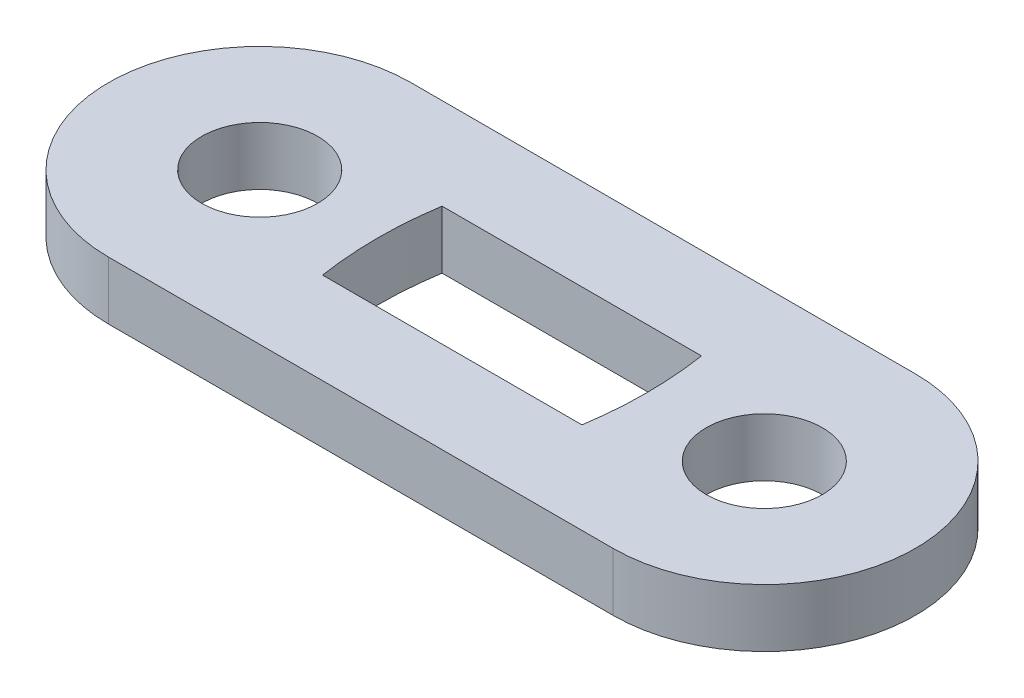
ISO-10303-21;
HEADER;
FILE_DESCRIPTION(('STEP AP214'),'2;1');
FILE_NAME('part.step','',(''),(''),'','','');
FILE_SCHEMA(('AUTOMOTIVE_DESIGN { 1 0 10303 214 1 1 1 1 }'));
ENDSEC;
DATA;
#1=APPLICATION_CONTEXT('core data for automotive mechanical design processes');
#2=APPLICATION_PROTOCOL_DEFINITION('international standard','automotive_design',2000,#1);
#3=PRODUCT_CONTEXT('',#1,'mechanical');
#4=PRODUCT('Part','Part','',(#3));
#5=PRODUCT_RELATED_PRODUCT_CATEGORY('part','',(#4));
#6=PRODUCT_DEFINITION_FORMATION('','',#4);
#7=PRODUCT_DEFINITION_CONTEXT('part definition',#1,'design');
#8=PRODUCT_DEFINITION('design','',#6,#7);
#9=PRODUCT_DEFINITION_SHAPE('','',#8);
#10=(LENGTH_UNIT() NAMED_UNIT(*) SI_UNIT(.MILLI.,.METRE.));
#11=(NAMED_UNIT(*) PLANE_ANGLE_UNIT() SI_UNIT($,.RADIAN.));
#12=(NAMED_UNIT(*) SI_UNIT($,.STERADIAN.) SOLID_ANGLE_UNIT());
#13=UNCERTAINTY_MEASURE_WITH_UNIT(LENGTH_MEASURE(1.E-05),#10,'distance_accuracy_value','');
#14=(GEOMETRIC_REPRESENTATION_CONTEXT(3) GLOBAL_UNCERTAINTY_ASSIGNED_CONTEXT((#13)) GLOBAL_UNIT_ASSIGNED_CONTEXT((#10,
#11,#12)) REPRESENTATION_CONTEXT('',''));
#15=CARTESIAN_POINT('',(0.,0.,0.));
#16=DIRECTION('',(0.,0.,1.));
#17=DIRECTION('',(1.,0.,0.));
#18=AXIS2_PLACEMENT_3D('',#15,#16,#17);
#19=CARTESIAN_POINT('',(0.,0.79375,4.13373631574242));
#20=DIRECTION('',(0.,0.,-1.));
#21=DIRECTION('',(-1.,0.,0.));
#22=AXIS2_PLACEMENT_3D('',#19,#20,#21);
#23=PLANE('',#22);
#24=DIRECTION('',(1.,0.,0.));
#25=VECTOR('',#24,1.);
#26=CARTESIAN_POINT('',(0.,-0.79375,4.13373631574242));
#27=LINE('',#26,#25);
#28=CARTESIAN_POINT('',(-6.9,-0.79375,4.13373631574242));
#29=VERTEX_POINT('',#28);
#30=CARTESIAN_POINT('',(6.9,-0.79375,4.13373631574243));
#31=VERTEX_POINT('',#30);
#32=EDGE_CURVE('E145',#29,#31,#27,.T.);
#33=ORIENTED_EDGE('',*,*,#32,.T.);
#34=DIRECTION('',(0.,-1.,0.));
#35=VECTOR('',#34,1.);
#36=CARTESIAN_POINT('',(6.9,0.79375,4.13373631574243));
#37=LINE('',#36,#35);
#38=CARTESIAN_POINT('',(6.9,0.79375,4.13373631574243));
#39=VERTEX_POINT('',#38);
#40=EDGE_CURVE('E11',#39,#31,#37,.T.);
#41=ORIENTED_EDGE('',*,*,#40,.F.);
#42=DIRECTION('',(1.,0.,0.));
#43=VECTOR('',#42,1.);
#44=CARTESIAN_POINT('',(0.,0.79375,4.13373631574242));
#45=LINE('',#44,#43);
#46=CARTESIAN_POINT('',(-6.9,0.79375,4.13373631574242));
#47=VERTEX_POINT('',#46);
#48=EDGE_CURVE('E115',#47,#39,#45,.T.);
#49=ORIENTED_EDGE('',*,*,#48,.F.);
#50=DIRECTION('',(0.,-1.,0.));
#51=VECTOR('',#50,1.);
#52=CARTESIAN_POINT('',(-6.9,0.79375,4.13373631574242));
#53=LINE('',#52,#51);
#54=EDGE_CURVE('E152',#47,#29,#53,.T.);
#55=ORIENTED_EDGE('',*,*,#54,.T.);
#56=EDGE_LOOP('',(#33,#41,#49,#55));
#57=FACE_BOUND('',#56,.T.);
#58=ADVANCED_FACE('F34',(#57),#23,.F.);
#59=CARTESIAN_POINT('',(6.9,0.79375,0.));
#60=DIRECTION('',(0.,-1.,0.));
#61=DIRECTION('',(0.,0.,-1.));
#62=AXIS2_PLACEMENT_3D('',#59,#60,#61);
#63=CYLINDRICAL_SURFACE('',#62,4.13373631574242);
#64=CARTESIAN_POINT('',(6.9,-0.79375,0.));
#65=DIRECTION('',(0.,1.,0.));
#66=DIRECTION('',(0.,0.,1.));
#67=AXIS2_PLACEMENT_3D('',#64,#65,#66);
#68=CIRCLE('',#67,4.13373631574242);
#69=CARTESIAN_POINT('',(6.9,-0.79375,-4.13373631574242));
#70=VERTEX_POINT('',#69);
#71=EDGE_CURVE('E120',#31,#70,#68,.T.);
#72=ORIENTED_EDGE('',*,*,#71,.T.);
#73=DIRECTION('',(0.,-1.,0.));
#74=VECTOR('',#73,1.);
#75=CARTESIAN_POINT('',(6.9,0.79375,-4.13373631574242));
#76=LINE('',#75,#74);
#77=CARTESIAN_POINT('',(6.9,0.79375,-4.13373631574242));
#78=VERTEX_POINT('',#77);
#79=EDGE_CURVE('E44',#78,#70,#76,.T.);
#80=ORIENTED_EDGE('',*,*,#79,.F.);
#81=CARTESIAN_POINT('',(6.9,0.79375,0.));
#82=DIRECTION('',(0.,1.,0.));
#83=DIRECTION('',(0.,0.,1.));
#84=AXIS2_PLACEMENT_3D('',#81,#82,#83);
#85=CIRCLE('',#84,4.13373631574242);
#86=EDGE_CURVE('E109',#39,#78,#85,.T.);
#87=ORIENTED_EDGE('',*,*,#86,.F.);
#88=ORIENTED_EDGE('',*,*,#40,.T.);
#89=EDGE_LOOP('',(#72,#80,#87,#88));
#90=FACE_BOUND('',#89,.T.);
#91=ADVANCED_FACE('F119',(#90),#63,.T.);
#92=CARTESIAN_POINT('',(0.,0.79375,-4.13373631574242));
#93=DIRECTION('',(0.,0.,1.));
#94=DIRECTION('',(1.,0.,0.));
#95=AXIS2_PLACEMENT_3D('',#92,#93,#94);
#96=PLANE('',#95);
#97=DIRECTION('',(-1.,0.,0.));
#98=VECTOR('',#97,1.);
#99=CARTESIAN_POINT('',(0.,-0.79375,-4.13373631574242));
#100=LINE('',#99,#98);
#101=CARTESIAN_POINT('',(-6.9,-0.79375,-4.13373631574242));
#102=VERTEX_POINT('',#101);
#103=EDGE_CURVE('E82',#70,#102,#100,.T.);
#104=ORIENTED_EDGE('',*,*,#103,.T.);
#105=DIRECTION('',(0.,-1.,0.));
#106=VECTOR('',#105,1.);
#107=CARTESIAN_POINT('',(-6.9,0.79375,-4.13373631574242));
#108=LINE('',#107,#106);
#109=CARTESIAN_POINT('',(-6.9,0.79375,-4.13373631574242));
#110=VERTEX_POINT('',#109);
#111=EDGE_CURVE('E121',#110,#102,#108,.T.);
#112=ORIENTED_EDGE('',*,*,#111,.F.);
#113=DIRECTION('',(-1.,0.,0.));
#114=VECTOR('',#113,1.);
#115=CARTESIAN_POINT('',(0.,0.79375,-4.13373631574242));
#116=LINE('',#115,#114);
#117=EDGE_CURVE('E113',#78,#110,#116,.T.);
#118=ORIENTED_EDGE('',*,*,#117,.F.);
#119=ORIENTED_EDGE('',*,*,#79,.T.);
#120=EDGE_LOOP('',(#104,#112,#118,#119));
#121=FACE_BOUND('',#120,.T.);
#122=ADVANCED_FACE('F123',(#121),#96,.F.);
#123=CARTESIAN_POINT('',(6.9,0.79375,0.));
#124=DIRECTION('',(0.,-1.,0.));
#125=DIRECTION('',(0.,0.,-1.));
#126=AXIS2_PLACEMENT_3D('',#123,#124,#125);
#127=CYLINDRICAL_SURFACE('',#126,10.5737712135297);
#128=CARTESIAN_POINT('',(6.9,-0.79375,0.));
#129=DIRECTION('',(0.,1.,0.));
#130=DIRECTION('',(0.,0.,1.));
#131=AXIS2_PLACEMENT_3D('',#128,#129,#130);
#132=CIRCLE('',#131,10.5737712135297);
#133=CARTESIAN_POINT('',(-3.54679584019391,-0.79375,-1.63373631574242));
#134=VERTEX_POINT('',#133);
#135=CARTESIAN_POINT('',(-3.54679584019391,-0.79375,1.63373631574243));
#136=VERTEX_POINT('',#135);
#137=EDGE_CURVE('E129',#134,#136,#132,.T.);
#138=ORIENTED_EDGE('',*,*,#137,.F.);
#139=DIRECTION('',(0.,-1.,0.));
#140=VECTOR('',#139,1.);
#141=CARTESIAN_POINT('',(-3.54679584019391,0.79375,-1.63373631574242));
#142=LINE('',#141,#140);
#143=CARTESIAN_POINT('',(-3.54679584019391,0.79375,-1.63373631574242));
#144=VERTEX_POINT('',#143);
#145=EDGE_CURVE('E38',#144,#134,#142,.T.);
#146=ORIENTED_EDGE('',*,*,#145,.F.);
#147=CARTESIAN_POINT('',(6.9,0.79375,0.));
#148=DIRECTION('',(0.,1.,0.));
#149=DIRECTION('',(0.,0.,1.));
#150=AXIS2_PLACEMENT_3D('',#147,#148,#149);
#151=CIRCLE('',#150,10.5737712135297);
#152=CARTESIAN_POINT('',(-3.54679584019391,0.79375,1.63373631574243));
#153=VERTEX_POINT('',#152);
#154=EDGE_CURVE('E151',#144,#153,#151,.T.);
#155=ORIENTED_EDGE('',*,*,#154,.T.);
#156=DIRECTION('',(0.,-1.,0.));
#157=VECTOR('',#156,1.);
#158=CARTESIAN_POINT('',(-3.54679584019391,0.79375,1.63373631574243));
#159=LINE('',#158,#157);
#160=EDGE_CURVE('E125',#153,#136,#159,.T.);
#161=ORIENTED_EDGE('',*,*,#160,.T.);
#162=EDGE_LOOP('',(#138,#146,#155,#161));
#163=FACE_BOUND('',#162,.T.);
#164=ADVANCED_FACE('F36',(#163),#127,.F.);
#165=CARTESIAN_POINT('',(0.,0.79375,-1.63373631574242));
#166=DIRECTION('',(0.,0.,-1.));
#167=DIRECTION('',(-1.,0.,0.));
#168=AXIS2_PLACEMENT_3D('',#165,#166,#167);
#169=PLANE('',#168);
#170=DIRECTION('',(1.,0.,0.));
#171=VECTOR('',#170,1.);
#172=CARTESIAN_POINT('',(0.,-0.79375,-1.63373631574242));
#173=LINE('',#172,#171);
#174=CARTESIAN_POINT('',(3.54679584019391,-0.79375,-1.63373631574242));
#175=VERTEX_POINT('',#174);
#176=EDGE_CURVE('E132',#134,#175,#173,.T.);
#177=ORIENTED_EDGE('',*,*,#176,.T.);
#178=DIRECTION('',(0.,-1.,0.));
#179=VECTOR('',#178,1.);
#180=CARTESIAN_POINT('',(3.54679584019391,0.79375,-1.63373631574242));
#181=LINE('',#180,#179);
#182=CARTESIAN_POINT('',(3.54679584019391,0.79375,-1.63373631574242));
#183=VERTEX_POINT('',#182);
#184=EDGE_CURVE('E158',#183,#175,#181,.T.);
#185=ORIENTED_EDGE('',*,*,#184,.F.);
#186=DIRECTION('',(1.,0.,0.));
#187=VECTOR('',#186,1.);
#188=CARTESIAN_POINT('',(0.,0.79375,-1.63373631574242));
#189=LINE('',#188,#187);
#190=EDGE_CURVE('E167',#144,#183,#189,.T.);
#191=ORIENTED_EDGE('',*,*,#190,.F.);
#192=ORIENTED_EDGE('',*,*,#145,.T.);
#193=EDGE_LOOP('',(#177,#185,#191,#192));
#194=FACE_BOUND('',#193,.T.);
#195=ADVANCED_FACE('F166',(#194),#169,.F.);
#196=CARTESIAN_POINT('',(-6.9,0.79375,0.));
#197=DIRECTION('',(0.,-1.,0.));
#198=DIRECTION('',(0.,0.,-1.));
#199=AXIS2_PLACEMENT_3D('',#196,#197,#198);
#200=CYLINDRICAL_SURFACE('',#199,10.5737712135297);
#201=CARTESIAN_POINT('',(-6.9,-0.79375,0.));
#202=DIRECTION('',(0.,1.,0.));
#203=DIRECTION('',(0.,0.,1.));
#204=AXIS2_PLACEMENT_3D('',#201,#202,#203);
#205=CIRCLE('',#204,10.5737712135297);
#206=CARTESIAN_POINT('',(3.54679584019391,-0.79375,1.63373631574243));
#207=VERTEX_POINT('',#206);
#208=EDGE_CURVE('E134',#175,#207,#205,.F.);
#209=ORIENTED_EDGE('',*,*,#208,.T.);
#210=DIRECTION('',(0.,-1.,0.));
#211=VECTOR('',#210,1.);
#212=CARTESIAN_POINT('',(3.54679584019391,0.79375,1.63373631574243));
#213=LINE('',#212,#211);
#214=CARTESIAN_POINT('',(3.54679584019391,0.79375,1.63373631574243));
#215=VERTEX_POINT('',#214);
#216=EDGE_CURVE('E156',#215,#207,#213,.T.);
#217=ORIENTED_EDGE('',*,*,#216,.F.);
#218=CARTESIAN_POINT('',(-6.9,0.79375,0.));
#219=DIRECTION('',(0.,1.,0.));
#220=DIRECTION('',(0.,0.,1.));
#221=AXIS2_PLACEMENT_3D('',#218,#219,#220);
#222=CIRCLE('',#221,10.5737712135297);
#223=EDGE_CURVE('E180',#183,#215,#222,.F.);
#224=ORIENTED_EDGE('',*,*,#223,.F.);
#225=ORIENTED_EDGE('',*,*,#184,.T.);
#226=EDGE_LOOP('',(#209,#217,#224,#225));
#227=FACE_BOUND('',#226,.T.);
#228=ADVANCED_FACE('F179',(#227),#200,.F.);
#229=CARTESIAN_POINT('',(-6.9,0.79375,0.));
#230=DIRECTION('',(0.,-1.,0.));
#231=DIRECTION('',(0.,0.,-1.));
#232=AXIS2_PLACEMENT_3D('',#229,#230,#231);
#233=CYLINDRICAL_SURFACE('',#232,1.5875);
#234=CARTESIAN_POINT('',(-6.9,0.79375,0.));
#235=DIRECTION('',(0.,1.,0.));
#236=DIRECTION('',(0.,0.,1.));
#237=AXIS2_PLACEMENT_3D('',#234,#235,#236);
#238=CIRCLE('',#237,1.5875);
#239=CARTESIAN_POINT('',(-6.9,0.79375,1.5875));
#240=VERTEX_POINT('',#239);
#241=EDGE_CURVE('E190',#240,#240,#238,.T.);
#242=ORIENTED_EDGE('',*,*,#241,.T.);
#243=EDGE_LOOP('',(#242));
#244=FACE_BOUND('',#243,.T.);
#245=CARTESIAN_POINT('',(-6.9,-0.79375,0.));
#246=DIRECTION('',(0.,1.,0.));
#247=DIRECTION('',(0.,0.,1.));
#248=AXIS2_PLACEMENT_3D('',#245,#246,#247);
#249=CIRCLE('',#248,1.5875);
#250=CARTESIAN_POINT('',(-6.9,-0.79375,1.5875));
#251=VERTEX_POINT('',#250);
#252=EDGE_CURVE('E142',#251,#251,#249,.T.);
#253=ORIENTED_EDGE('',*,*,#252,.F.);
#254=EDGE_LOOP('',(#253));
#255=FACE_BOUND('',#254,.T.);
#256=ADVANCED_FACE('F194',(#244,#255),#233,.F.);
#257=CARTESIAN_POINT('',(6.9,0.79375,0.));
#258=DIRECTION('',(0.,-1.,0.));
#259=DIRECTION('',(0.,0.,-1.));
#260=AXIS2_PLACEMENT_3D('',#257,#258,#259);
#261=CYLINDRICAL_SURFACE('',#260,1.5875);
#262=CARTESIAN_POINT('',(6.9,0.79375,0.));
#263=DIRECTION('',(0.,1.,0.));
#264=DIRECTION('',(0.,0.,1.));
#265=AXIS2_PLACEMENT_3D('',#262,#263,#264);
#266=CIRCLE('',#265,1.5875);
#267=CARTESIAN_POINT('',(6.9,0.79375,1.5875));
#268=VERTEX_POINT('',#267);
#269=EDGE_CURVE('E183',#268,#268,#266,.T.);
#270=ORIENTED_EDGE('',*,*,#269,.T.);
#271=EDGE_LOOP('',(#270));
#272=FACE_BOUND('',#271,.T.);
#273=CARTESIAN_POINT('',(6.9,-0.79375,0.));
#274=DIRECTION('',(0.,1.,0.));
#275=DIRECTION('',(0.,0.,1.));
#276=AXIS2_PLACEMENT_3D('',#273,#274,#275);
#277=CIRCLE('',#276,1.5875);
#278=CARTESIAN_POINT('',(6.9,-0.79375,1.5875));
#279=VERTEX_POINT('',#278);
#280=EDGE_CURVE('E139',#279,#279,#277,.T.);
#281=ORIENTED_EDGE('',*,*,#280,.F.);
#282=EDGE_LOOP('',(#281));
#283=FACE_BOUND('',#282,.T.);
#284=ADVANCED_FACE('F218',(#272,#283),#261,.F.);
#285=CARTESIAN_POINT('',(0.,0.79375,1.63373631574243));
#286=DIRECTION('',(0.,0.,1.));
#287=DIRECTION('',(1.,0.,0.));
#288=AXIS2_PLACEMENT_3D('',#285,#286,#287);
#289=PLANE('',#288);
#290=DIRECTION('',(-1.,0.,0.));
#291=VECTOR('',#290,1.);
#292=CARTESIAN_POINT('',(0.,-0.79375,1.63373631574243));
#293=LINE('',#292,#291);
#294=EDGE_CURVE('E136',#207,#136,#293,.T.);
#295=ORIENTED_EDGE('',*,*,#294,.T.);
#296=ORIENTED_EDGE('',*,*,#160,.F.);
#297=DIRECTION('',(-1.,0.,0.));
#298=VECTOR('',#297,1.);
#299=CARTESIAN_POINT('',(0.,0.79375,1.63373631574243));
#300=LINE('',#299,#298);
#301=EDGE_CURVE('E178',#215,#153,#300,.T.);
#302=ORIENTED_EDGE('',*,*,#301,.F.);
#303=ORIENTED_EDGE('',*,*,#216,.T.);
#304=EDGE_LOOP('',(#295,#296,#302,#303));
#305=FACE_BOUND('',#304,.T.);
#306=ADVANCED_FACE('F176',(#305),#289,.F.);
#307=CARTESIAN_POINT('',(-6.9,0.79375,0.));
#308=DIRECTION('',(0.,-1.,0.));
#309=DIRECTION('',(0.,0.,-1.));
#310=AXIS2_PLACEMENT_3D('',#307,#308,#309);
#311=CYLINDRICAL_SURFACE('',#310,4.13373631574242);
#312=CARTESIAN_POINT('',(-6.9,-0.79375,0.));
#313=DIRECTION('',(0.,1.,0.));
#314=DIRECTION('',(0.,0.,1.));
#315=AXIS2_PLACEMENT_3D('',#312,#313,#314);
#316=CIRCLE('',#315,4.13373631574242);
#317=EDGE_CURVE('E88',#102,#29,#316,.T.);
#318=ORIENTED_EDGE('',*,*,#317,.T.);
#319=ORIENTED_EDGE('',*,*,#54,.F.);
#320=CARTESIAN_POINT('',(-6.9,0.79375,0.));
#321=DIRECTION('',(0.,1.,0.));
#322=DIRECTION('',(0.,0.,1.));
#323=AXIS2_PLACEMENT_3D('',#320,#321,#322);
#324=CIRCLE('',#323,4.13373631574242);
#325=EDGE_CURVE('E53',#110,#47,#324,.T.);
#326=ORIENTED_EDGE('',*,*,#325,.F.);
#327=ORIENTED_EDGE('',*,*,#111,.T.);
#328=EDGE_LOOP('',(#318,#319,#326,#327));
#329=FACE_BOUND('',#328,.T.);
#330=ADVANCED_FACE('F198',(#329),#311,.T.);
#331=CARTESIAN_POINT('',(0.,0.79375,0.));
#332=DIRECTION('',(0.,1.,0.));
#333=DIRECTION('',(0.,0.,1.));
#334=AXIS2_PLACEMENT_3D('',#331,#332,#333);
#335=PLANE('',#334);
#336=ORIENTED_EDGE('',*,*,#154,.F.);
#337=ORIENTED_EDGE('',*,*,#190,.T.);
#338=ORIENTED_EDGE('',*,*,#223,.T.);
#339=ORIENTED_EDGE('',*,*,#301,.T.);
#340=EDGE_LOOP('',(#336,#337,#338,#339));
#341=FACE_BOUND('',#340,.T.);
#342=ORIENTED_EDGE('',*,*,#269,.F.);
#343=EDGE_LOOP('',(#342));
#344=FACE_BOUND('',#343,.T.);
#345=ORIENTED_EDGE('',*,*,#241,.F.);
#346=EDGE_LOOP('',(#345));
#347=FACE_BOUND('',#346,.T.);
#348=ORIENTED_EDGE('',*,*,#48,.T.);
#349=ORIENTED_EDGE('',*,*,#86,.T.);
#350=ORIENTED_EDGE('',*,*,#117,.T.);
#351=ORIENTED_EDGE('',*,*,#325,.T.);
#352=EDGE_LOOP('',(#348,#349,#350,#351));
#353=FACE_BOUND('',#352,.T.);
#354=ADVANCED_FACE('F111',(#341,#344,#347,#353),#335,.T.);
#355=CARTESIAN_POINT('',(0.,-0.79375,0.));
#356=DIRECTION('',(0.,1.,0.));
#357=DIRECTION('',(0.,0.,1.));
#358=AXIS2_PLACEMENT_3D('',#355,#356,#357);
#359=PLANE('',#358);
#360=ORIENTED_EDGE('',*,*,#137,.T.);
#361=ORIENTED_EDGE('',*,*,#294,.F.);
#362=ORIENTED_EDGE('',*,*,#208,.F.);
#363=ORIENTED_EDGE('',*,*,#176,.F.);
#364=EDGE_LOOP('',(#360,#361,#362,#363));
#365=FACE_BOUND('',#364,.T.);
#366=ORIENTED_EDGE('',*,*,#280,.T.);
#367=EDGE_LOOP('',(#366));
#368=FACE_BOUND('',#367,.T.);
#369=ORIENTED_EDGE('',*,*,#252,.T.);
#370=EDGE_LOOP('',(#369));
#371=FACE_BOUND('',#370,.T.);
#372=ORIENTED_EDGE('',*,*,#32,.F.);
#373=ORIENTED_EDGE('',*,*,#317,.F.);
#374=ORIENTED_EDGE('',*,*,#103,.F.);
#375=ORIENTED_EDGE('',*,*,#71,.F.);
#376=EDGE_LOOP('',(#372,#373,#374,#375));
#377=FACE_BOUND('',#376,.T.);
#378=ADVANCED_FACE('F170',(#365,#368,#371,#377),#359,.F.);
#379=CLOSED_SHELL('',(#58,#91,#122,#164,#195,#228,#256,#284,#306,#330,#354,#378));
#380=MANIFOLD_SOLID_BREP('B2',#379);
#381=ADVANCED_BREP_SHAPE_REPRESENTATION('',(#18,#380),#14);
#382=SHAPE_DEFINITION_REPRESENTATION(#9,#381);
ENDSEC;
END-ISO-10303-21;
